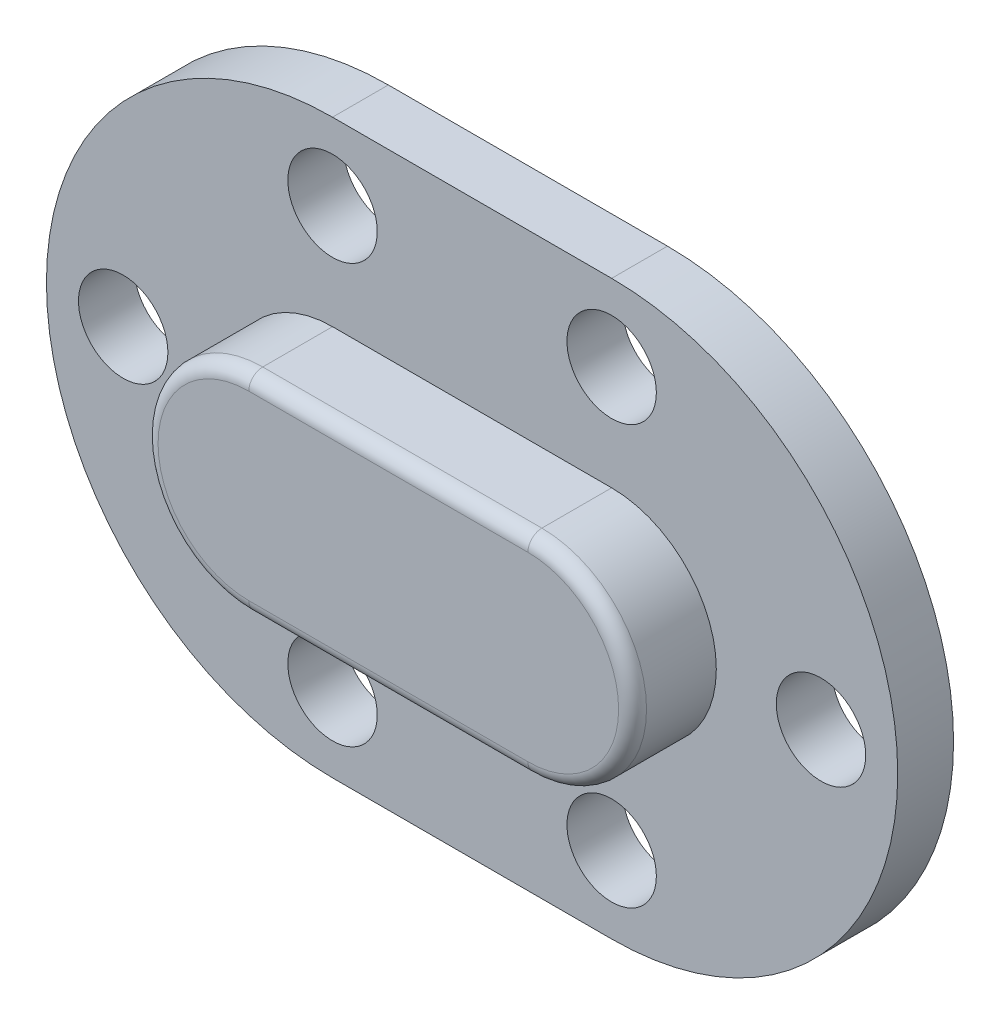
ISO-10303-21;
HEADER;
FILE_DESCRIPTION(('STEP AP214'),'2;1');
FILE_NAME('part.step','',(''),(''),'','','');
FILE_SCHEMA(('AUTOMOTIVE_DESIGN { 1 0 10303 214 1 1 1 1 }'));
ENDSEC;
DATA;
#1=APPLICATION_CONTEXT('core data for automotive mechanical design processes');
#2=APPLICATION_PROTOCOL_DEFINITION('international standard','automotive_design',2000,#1);
#3=PRODUCT_CONTEXT('',#1,'mechanical');
#4=PRODUCT('Part','Part','',(#3));
#5=PRODUCT_RELATED_PRODUCT_CATEGORY('part','',(#4));
#6=PRODUCT_DEFINITION_FORMATION('','',#4);
#7=PRODUCT_DEFINITION_CONTEXT('part definition',#1,'design');
#8=PRODUCT_DEFINITION('design','',#6,#7);
#9=PRODUCT_DEFINITION_SHAPE('','',#8);
#10=(LENGTH_UNIT() NAMED_UNIT(*) SI_UNIT(.MILLI.,.METRE.));
#11=(NAMED_UNIT(*) PLANE_ANGLE_UNIT() SI_UNIT($,.RADIAN.));
#12=(NAMED_UNIT(*) SI_UNIT($,.STERADIAN.) SOLID_ANGLE_UNIT());
#13=UNCERTAINTY_MEASURE_WITH_UNIT(LENGTH_MEASURE(1.E-05),#10,'distance_accuracy_value','');
#14=(GEOMETRIC_REPRESENTATION_CONTEXT(3) GLOBAL_UNCERTAINTY_ASSIGNED_CONTEXT((#13)) GLOBAL_UNIT_ASSIGNED_CONTEXT((#10,
#11,#12)) REPRESENTATION_CONTEXT('',''));
#15=CARTESIAN_POINT('',(0.,0.,0.));
#16=DIRECTION('',(0.,0.,1.));
#17=DIRECTION('',(1.,0.,0.));
#18=AXIS2_PLACEMENT_3D('',#15,#16,#17);
#19=CARTESIAN_POINT('',(-10.,0.,4.));
#20=DIRECTION('',(0.,0.,-1.));
#21=DIRECTION('',(-1.,0.,0.));
#22=AXIS2_PLACEMENT_3D('',#19,#20,#21);
#23=CYLINDRICAL_SURFACE('',#22,20.5);
#24=CARTESIAN_POINT('',(-10.,0.,0.));
#25=DIRECTION('',(0.,0.,1.));
#26=DIRECTION('',(1.,0.,0.));
#27=AXIS2_PLACEMENT_3D('',#24,#25,#26);
#28=CIRCLE('',#27,20.5);
#29=CARTESIAN_POINT('',(-10.,20.5,0.));
#30=VERTEX_POINT('',#29);
#31=CARTESIAN_POINT('',(-10.,-20.5,0.));
#32=VERTEX_POINT('',#31);
#33=EDGE_CURVE('E175',#30,#32,#28,.T.);
#34=ORIENTED_EDGE('',*,*,#33,.T.);
#35=DIRECTION('',(0.,0.,-1.));
#36=VECTOR('',#35,1.);
#37=CARTESIAN_POINT('',(-10.,-20.5,4.));
#38=LINE('',#37,#36);
#39=CARTESIAN_POINT('',(-10.,-20.5,4.));
#40=VERTEX_POINT('',#39);
#41=EDGE_CURVE('E213',#40,#32,#38,.T.);
#42=ORIENTED_EDGE('',*,*,#41,.F.);
#43=CARTESIAN_POINT('',(-10.,0.,4.));
#44=DIRECTION('',(0.,0.,1.));
#45=DIRECTION('',(1.,0.,0.));
#46=AXIS2_PLACEMENT_3D('',#43,#44,#45);
#47=CIRCLE('',#46,20.5);
#48=CARTESIAN_POINT('',(-10.,20.5,4.));
#49=VERTEX_POINT('',#48);
#50=EDGE_CURVE('E176',#49,#40,#47,.T.);
#51=ORIENTED_EDGE('',*,*,#50,.F.);
#52=DIRECTION('',(0.,0.,-1.));
#53=VECTOR('',#52,1.);
#54=CARTESIAN_POINT('',(-10.,20.5,4.));
#55=LINE('',#54,#53);
#56=EDGE_CURVE('E190',#49,#30,#55,.T.);
#57=ORIENTED_EDGE('',*,*,#56,.T.);
#58=EDGE_LOOP('',(#34,#42,#51,#57));
#59=FACE_BOUND('',#58,.T.);
#60=ADVANCED_FACE('F38',(#59),#23,.T.);
#61=CARTESIAN_POINT('',(-10.,-20.5,4.));
#62=DIRECTION('',(0.,1.,0.));
#63=DIRECTION('',(0.,0.,1.));
#64=AXIS2_PLACEMENT_3D('',#61,#62,#63);
#65=PLANE('',#64);
#66=DIRECTION('',(1.,0.,0.));
#67=VECTOR('',#66,1.);
#68=CARTESIAN_POINT('',(-10.,-20.5,0.));
#69=LINE('',#68,#67);
#70=CARTESIAN_POINT('',(10.,-20.5,0.));
#71=VERTEX_POINT('',#70);
#72=EDGE_CURVE('E194',#32,#71,#69,.T.);
#73=ORIENTED_EDGE('',*,*,#72,.T.);
#74=DIRECTION('',(0.,0.,-1.));
#75=VECTOR('',#74,1.);
#76=CARTESIAN_POINT('',(10.,-20.5,4.));
#77=LINE('',#76,#75);
#78=CARTESIAN_POINT('',(10.,-20.5,4.));
#79=VERTEX_POINT('',#78);
#80=EDGE_CURVE('E209',#79,#71,#77,.T.);
#81=ORIENTED_EDGE('',*,*,#80,.F.);
#82=DIRECTION('',(1.,0.,0.));
#83=VECTOR('',#82,1.);
#84=CARTESIAN_POINT('',(-10.,-20.5,4.));
#85=LINE('',#84,#83);
#86=EDGE_CURVE('E180',#40,#79,#85,.T.);
#87=ORIENTED_EDGE('',*,*,#86,.F.);
#88=ORIENTED_EDGE('',*,*,#41,.T.);
#89=EDGE_LOOP('',(#73,#81,#87,#88));
#90=FACE_BOUND('',#89,.T.);
#91=ADVANCED_FACE('F287',(#90),#65,.F.);
#92=CARTESIAN_POINT('',(10.,0.,4.));
#93=DIRECTION('',(0.,0.,-1.));
#94=DIRECTION('',(-1.,0.,0.));
#95=AXIS2_PLACEMENT_3D('',#92,#93,#94);
#96=CYLINDRICAL_SURFACE('',#95,20.5);
#97=CARTESIAN_POINT('',(10.,0.,0.));
#98=DIRECTION('',(0.,0.,1.));
#99=DIRECTION('',(1.,0.,0.));
#100=AXIS2_PLACEMENT_3D('',#97,#98,#99);
#101=CIRCLE('',#100,20.5);
#102=CARTESIAN_POINT('',(10.,20.5,0.));
#103=VERTEX_POINT('',#102);
#104=EDGE_CURVE('E197',#71,#103,#101,.T.);
#105=ORIENTED_EDGE('',*,*,#104,.T.);
#106=DIRECTION('',(0.,0.,-1.));
#107=VECTOR('',#106,1.);
#108=CARTESIAN_POINT('',(10.,20.5,4.));
#109=LINE('',#108,#107);
#110=CARTESIAN_POINT('',(10.,20.5,4.));
#111=VERTEX_POINT('',#110);
#112=EDGE_CURVE('E205',#111,#103,#109,.T.);
#113=ORIENTED_EDGE('',*,*,#112,.F.);
#114=CARTESIAN_POINT('',(10.,0.,4.));
#115=DIRECTION('',(0.,0.,1.));
#116=DIRECTION('',(1.,0.,0.));
#117=AXIS2_PLACEMENT_3D('',#114,#115,#116);
#118=CIRCLE('',#117,20.5);
#119=EDGE_CURVE('E184',#79,#111,#118,.T.);
#120=ORIENTED_EDGE('',*,*,#119,.F.);
#121=ORIENTED_EDGE('',*,*,#80,.T.);
#122=EDGE_LOOP('',(#105,#113,#120,#121));
#123=FACE_BOUND('',#122,.T.);
#124=ADVANCED_FACE('F293',(#123),#96,.T.);
#125=CARTESIAN_POINT('',(-10.,20.5,4.));
#126=DIRECTION('',(0.,-1.,0.));
#127=DIRECTION('',(0.,0.,-1.));
#128=AXIS2_PLACEMENT_3D('',#125,#126,#127);
#129=PLANE('',#128);
#130=DIRECTION('',(-1.,0.,0.));
#131=VECTOR('',#130,1.);
#132=CARTESIAN_POINT('',(-10.,20.5,0.));
#133=LINE('',#132,#131);
#134=EDGE_CURVE('E181',#103,#30,#133,.T.);
#135=ORIENTED_EDGE('',*,*,#134,.T.);
#136=ORIENTED_EDGE('',*,*,#56,.F.);
#137=DIRECTION('',(-1.,0.,0.));
#138=VECTOR('',#137,1.);
#139=CARTESIAN_POINT('',(-10.,20.5,4.));
#140=LINE('',#139,#138);
#141=EDGE_CURVE('E187',#111,#49,#140,.T.);
#142=ORIENTED_EDGE('',*,*,#141,.F.);
#143=ORIENTED_EDGE('',*,*,#112,.T.);
#144=EDGE_LOOP('',(#135,#136,#142,#143));
#145=FACE_BOUND('',#144,.T.);
#146=ADVANCED_FACE('F338',(#145),#129,.F.);
#147=CARTESIAN_POINT('',(-10.,0.,4.));
#148=DIRECTION('',(0.,0.,1.));
#149=DIRECTION('',(1.,0.,0.));
#150=AXIS2_PLACEMENT_3D('',#147,#148,#149);
#151=PLANE('',#150);
#152=CARTESIAN_POINT('',(10.,15.,4.));
#153=DIRECTION('',(0.,0.,1.));
#154=DIRECTION('',(1.,0.,0.));
#155=AXIS2_PLACEMENT_3D('',#152,#153,#154);
#156=CIRCLE('',#155,3.20354728429973);
#157=CARTESIAN_POINT('',(13.2035472842997,15.,4.));
#158=VERTEX_POINT('',#157);
#159=EDGE_CURVE('E485',#158,#158,#156,.F.);
#160=ORIENTED_EDGE('',*,*,#159,.T.);
#161=EDGE_LOOP('',(#160));
#162=FACE_BOUND('',#161,.T.);
#163=CARTESIAN_POINT('',(25.,0.,4.));
#164=DIRECTION('',(0.,0.,1.));
#165=DIRECTION('',(1.,0.,0.));
#166=AXIS2_PLACEMENT_3D('',#163,#164,#165);
#167=CIRCLE('',#166,3.20354728429973);
#168=CARTESIAN_POINT('',(28.2035472842997,0.,4.));
#169=VERTEX_POINT('',#168);
#170=EDGE_CURVE('E496',#169,#169,#167,.F.);
#171=ORIENTED_EDGE('',*,*,#170,.T.);
#172=EDGE_LOOP('',(#171));
#173=FACE_BOUND('',#172,.T.);
#174=CARTESIAN_POINT('',(10.,-15.,4.));
#175=DIRECTION('',(0.,0.,1.));
#176=DIRECTION('',(1.,0.,0.));
#177=AXIS2_PLACEMENT_3D('',#174,#175,#176);
#178=CIRCLE('',#177,3.20354728429973);
#179=CARTESIAN_POINT('',(13.2035472842997,-15.,4.));
#180=VERTEX_POINT('',#179);
#181=EDGE_CURVE('E490',#180,#180,#178,.F.);
#182=ORIENTED_EDGE('',*,*,#181,.T.);
#183=EDGE_LOOP('',(#182));
#184=FACE_BOUND('',#183,.T.);
#185=CARTESIAN_POINT('',(-25.,0.,4.));
#186=DIRECTION('',(0.,0.,1.));
#187=DIRECTION('',(1.,0.,0.));
#188=AXIS2_PLACEMENT_3D('',#185,#186,#187);
#189=CIRCLE('',#188,3.20354728429973);
#190=CARTESIAN_POINT('',(-21.7964527157003,0.,4.));
#191=VERTEX_POINT('',#190);
#192=EDGE_CURVE('E522',#191,#191,#189,.T.);
#193=ORIENTED_EDGE('',*,*,#192,.F.);
#194=EDGE_LOOP('',(#193));
#195=FACE_BOUND('',#194,.T.);
#196=CARTESIAN_POINT('',(-10.,-15.,4.));
#197=DIRECTION('',(0.,0.,1.));
#198=DIRECTION('',(1.,0.,0.));
#199=AXIS2_PLACEMENT_3D('',#196,#197,#198);
#200=CIRCLE('',#199,3.20354728429973);
#201=CARTESIAN_POINT('',(-6.79645271570027,-15.,4.));
#202=VERTEX_POINT('',#201);
#203=EDGE_CURVE('E515',#202,#202,#200,.T.);
#204=ORIENTED_EDGE('',*,*,#203,.F.);
#205=EDGE_LOOP('',(#204));
#206=FACE_BOUND('',#205,.T.);
#207=CARTESIAN_POINT('',(-10.,15.,4.));
#208=DIRECTION('',(0.,0.,1.));
#209=DIRECTION('',(1.,0.,0.));
#210=AXIS2_PLACEMENT_3D('',#207,#208,#209);
#211=CIRCLE('',#210,3.20354728429973);
#212=CARTESIAN_POINT('',(-6.79645271570027,15.,4.));
#213=VERTEX_POINT('',#212);
#214=EDGE_CURVE('E242',#213,#213,#211,.T.);
#215=ORIENTED_EDGE('',*,*,#214,.F.);
#216=EDGE_LOOP('',(#215));
#217=FACE_BOUND('',#216,.T.);
#218=CARTESIAN_POINT('',(-10.,0.,4.));
#219=DIRECTION('',(0.,0.,1.));
#220=DIRECTION('',(1.,0.,0.));
#221=AXIS2_PLACEMENT_3D('',#218,#219,#220);
#222=CIRCLE('',#221,7.5);
#223=CARTESIAN_POINT('',(-10.,7.5,4.));
#224=VERTEX_POINT('',#223);
#225=CARTESIAN_POINT('',(-10.,-7.5,4.));
#226=VERTEX_POINT('',#225);
#227=EDGE_CURVE('E147',#224,#226,#222,.T.);
#228=ORIENTED_EDGE('',*,*,#227,.F.);
#229=DIRECTION('',(-1.,0.,0.));
#230=VECTOR('',#229,1.);
#231=CARTESIAN_POINT('',(-10.,7.5,4.));
#232=LINE('',#231,#230);
#233=CARTESIAN_POINT('',(10.,7.5,4.));
#234=VERTEX_POINT('',#233);
#235=EDGE_CURVE('E159',#234,#224,#232,.T.);
#236=ORIENTED_EDGE('',*,*,#235,.F.);
#237=CARTESIAN_POINT('',(10.,0.,4.));
#238=DIRECTION('',(0.,0.,1.));
#239=DIRECTION('',(1.,0.,0.));
#240=AXIS2_PLACEMENT_3D('',#237,#238,#239);
#241=CIRCLE('',#240,7.5);
#242=CARTESIAN_POINT('',(10.,-7.5,4.));
#243=VERTEX_POINT('',#242);
#244=EDGE_CURVE('E155',#243,#234,#241,.T.);
#245=ORIENTED_EDGE('',*,*,#244,.F.);
#246=DIRECTION('',(1.,0.,0.));
#247=VECTOR('',#246,1.);
#248=CARTESIAN_POINT('',(-10.,-7.5,4.));
#249=LINE('',#248,#247);
#250=EDGE_CURVE('E151',#226,#243,#249,.T.);
#251=ORIENTED_EDGE('',*,*,#250,.F.);
#252=EDGE_LOOP('',(#228,#236,#245,#251));
#253=FACE_BOUND('',#252,.T.);
#254=ORIENTED_EDGE('',*,*,#50,.T.);
#255=ORIENTED_EDGE('',*,*,#86,.T.);
#256=ORIENTED_EDGE('',*,*,#119,.T.);
#257=ORIENTED_EDGE('',*,*,#141,.T.);
#258=EDGE_LOOP('',(#254,#255,#256,#257));
#259=FACE_BOUND('',#258,.T.);
#260=ADVANCED_FACE('F327',(#162,#173,#184,#195,#206,#217,#253,#259),#151,.T.);
#261=CARTESIAN_POINT('',(-10.,0.,0.));
#262=DIRECTION('',(0.,0.,1.));
#263=DIRECTION('',(1.,0.,0.));
#264=AXIS2_PLACEMENT_3D('',#261,#262,#263);
#265=PLANE('',#264);
#266=CARTESIAN_POINT('',(10.,15.,0.));
#267=DIRECTION('',(0.,0.,-1.));
#268=DIRECTION('',(-1.,0.,0.));
#269=AXIS2_PLACEMENT_3D('',#266,#267,#268);
#270=CIRCLE('',#269,3.20354728429973);
#271=CARTESIAN_POINT('',(6.79645271570027,15.,0.));
#272=VERTEX_POINT('',#271);
#273=EDGE_CURVE('E488',#272,#272,#270,.T.);
#274=ORIENTED_EDGE('',*,*,#273,.F.);
#275=EDGE_LOOP('',(#274));
#276=FACE_BOUND('',#275,.T.);
#277=CARTESIAN_POINT('',(25.,0.,0.));
#278=DIRECTION('',(0.,0.,-1.));
#279=DIRECTION('',(0.,1.,0.));
#280=AXIS2_PLACEMENT_3D('',#277,#278,#279);
#281=CIRCLE('',#280,3.20354728429973);
#282=CARTESIAN_POINT('',(25.,3.20354728429968,0.));
#283=VERTEX_POINT('',#282);
#284=EDGE_CURVE('E491',#283,#283,#281,.T.);
#285=ORIENTED_EDGE('',*,*,#284,.F.);
#286=EDGE_LOOP('',(#285));
#287=FACE_BOUND('',#286,.T.);
#288=CARTESIAN_POINT('',(10.,-15.,0.));
#289=DIRECTION('',(0.,0.,-1.));
#290=DIRECTION('',(1.,0.,0.));
#291=AXIS2_PLACEMENT_3D('',#288,#289,#290);
#292=CIRCLE('',#291,3.20354728429973);
#293=CARTESIAN_POINT('',(13.2035472842997,-15.,0.));
#294=VERTEX_POINT('',#293);
#295=EDGE_CURVE('E499',#294,#294,#292,.T.);
#296=ORIENTED_EDGE('',*,*,#295,.F.);
#297=EDGE_LOOP('',(#296));
#298=FACE_BOUND('',#297,.T.);
#299=CARTESIAN_POINT('',(-25.,0.,0.));
#300=DIRECTION('',(0.,0.,1.));
#301=DIRECTION('',(0.,1.,0.));
#302=AXIS2_PLACEMENT_3D('',#299,#300,#301);
#303=CIRCLE('',#302,3.20354728429973);
#304=CARTESIAN_POINT('',(-25.,3.20354728429968,0.));
#305=VERTEX_POINT('',#304);
#306=EDGE_CURVE('E511',#305,#305,#303,.T.);
#307=ORIENTED_EDGE('',*,*,#306,.T.);
#308=EDGE_LOOP('',(#307));
#309=FACE_BOUND('',#308,.T.);
#310=CARTESIAN_POINT('',(-10.,-15.,0.));
#311=DIRECTION('',(0.,0.,1.));
#312=DIRECTION('',(-1.,0.,0.));
#313=AXIS2_PLACEMENT_3D('',#310,#311,#312);
#314=CIRCLE('',#313,3.20354728429973);
#315=CARTESIAN_POINT('',(-13.2035472842997,-15.,0.));
#316=VERTEX_POINT('',#315);
#317=EDGE_CURVE('E510',#316,#316,#314,.T.);
#318=ORIENTED_EDGE('',*,*,#317,.T.);
#319=EDGE_LOOP('',(#318));
#320=FACE_BOUND('',#319,.T.);
#321=CARTESIAN_POINT('',(-10.,15.,0.));
#322=DIRECTION('',(0.,0.,1.));
#323=DIRECTION('',(1.,0.,0.));
#324=AXIS2_PLACEMENT_3D('',#321,#322,#323);
#325=CIRCLE('',#324,3.20354728429973);
#326=CARTESIAN_POINT('',(-6.79645271570027,15.,0.));
#327=VERTEX_POINT('',#326);
#328=EDGE_CURVE('E526',#327,#327,#325,.T.);
#329=ORIENTED_EDGE('',*,*,#328,.T.);
#330=EDGE_LOOP('',(#329));
#331=FACE_BOUND('',#330,.T.);
#332=CARTESIAN_POINT('',(10.,0.,0.));
#333=DIRECTION('',(0.,0.,-1.));
#334=DIRECTION('',(-1.,0.,0.));
#335=AXIS2_PLACEMENT_3D('',#332,#333,#334);
#336=CIRCLE('',#335,3.99999999999999);
#337=CARTESIAN_POINT('',(6.00000000000001,0.,0.));
#338=VERTEX_POINT('',#337);
#339=EDGE_CURVE('E133',#338,#338,#336,.T.);
#340=ORIENTED_EDGE('',*,*,#339,.F.);
#341=EDGE_LOOP('',(#340));
#342=FACE_BOUND('',#341,.T.);
#343=CARTESIAN_POINT('',(-10.,0.,0.));
#344=DIRECTION('',(0.,0.,-1.));
#345=DIRECTION('',(-1.,0.,0.));
#346=AXIS2_PLACEMENT_3D('',#343,#344,#345);
#347=CIRCLE('',#346,3.99999999999999);
#348=CARTESIAN_POINT('',(-14.,0.,0.));
#349=VERTEX_POINT('',#348);
#350=EDGE_CURVE('E132',#349,#349,#347,.T.);
#351=ORIENTED_EDGE('',*,*,#350,.F.);
#352=EDGE_LOOP('',(#351));
#353=FACE_BOUND('',#352,.T.);
#354=ORIENTED_EDGE('',*,*,#33,.F.);
#355=ORIENTED_EDGE('',*,*,#134,.F.);
#356=ORIENTED_EDGE('',*,*,#104,.F.);
#357=ORIENTED_EDGE('',*,*,#72,.F.);
#358=EDGE_LOOP('',(#354,#355,#356,#357));
#359=FACE_BOUND('',#358,.T.);
#360=ADVANCED_FACE('F324',(#276,#287,#298,#309,#320,#331,#342,#353,#359),#265,.F.);
#361=CARTESIAN_POINT('',(-10.,0.,10.));
#362=DIRECTION('',(0.,0.,-1.));
#363=DIRECTION('',(-1.,0.,0.));
#364=AXIS2_PLACEMENT_3D('',#361,#362,#363);
#365=CYLINDRICAL_SURFACE('',#364,7.5);
#366=DIRECTION('',(0.,0.,-1.));
#367=VECTOR('',#366,1.);
#368=CARTESIAN_POINT('',(-10.,-7.5,10.));
#369=LINE('',#368,#367);
#370=CARTESIAN_POINT('',(-10.,-7.5,9.));
#371=VERTEX_POINT('',#370);
#372=EDGE_CURVE('E172',#371,#226,#369,.T.);
#373=ORIENTED_EDGE('',*,*,#372,.F.);
#374=CARTESIAN_POINT('',(-10.,0.,9.));
#375=DIRECTION('',(0.,0.,1.));
#376=DIRECTION('',(1.,0.,0.));
#377=AXIS2_PLACEMENT_3D('',#374,#375,#376);
#378=CIRCLE('',#377,7.5);
#379=CARTESIAN_POINT('',(-10.,7.5,9.));
#380=VERTEX_POINT('',#379);
#381=EDGE_CURVE('E11',#371,#380,#378,.F.);
#382=ORIENTED_EDGE('',*,*,#381,.T.);
#383=DIRECTION('',(0.,0.,-1.));
#384=VECTOR('',#383,1.);
#385=CARTESIAN_POINT('',(-10.,7.5,10.));
#386=LINE('',#385,#384);
#387=EDGE_CURVE('E163',#380,#224,#386,.T.);
#388=ORIENTED_EDGE('',*,*,#387,.T.);
#389=ORIENTED_EDGE('',*,*,#227,.T.);
#390=EDGE_LOOP('',(#373,#382,#388,#389));
#391=FACE_BOUND('',#390,.T.);
#392=ADVANCED_FACE('F264',(#391),#365,.T.);
#393=CARTESIAN_POINT('',(-10.,-7.5,10.));
#394=DIRECTION('',(0.,1.,0.));
#395=DIRECTION('',(0.,0.,1.));
#396=AXIS2_PLACEMENT_3D('',#393,#394,#395);
#397=PLANE('',#396);
#398=DIRECTION('',(0.,0.,-1.));
#399=VECTOR('',#398,1.);
#400=CARTESIAN_POINT('',(10.,-7.5,10.));
#401=LINE('',#400,#399);
#402=CARTESIAN_POINT('',(10.,-7.5,9.));
#403=VERTEX_POINT('',#402);
#404=EDGE_CURVE('E169',#403,#243,#401,.T.);
#405=ORIENTED_EDGE('',*,*,#404,.F.);
#406=DIRECTION('',(1.,0.,0.));
#407=VECTOR('',#406,1.);
#408=CARTESIAN_POINT('',(-10.,-7.5,9.));
#409=LINE('',#408,#407);
#410=EDGE_CURVE('E48',#403,#371,#409,.F.);
#411=ORIENTED_EDGE('',*,*,#410,.T.);
#412=ORIENTED_EDGE('',*,*,#372,.T.);
#413=ORIENTED_EDGE('',*,*,#250,.T.);
#414=EDGE_LOOP('',(#405,#411,#412,#413));
#415=FACE_BOUND('',#414,.T.);
#416=ADVANCED_FACE('F384',(#415),#397,.F.);
#417=CARTESIAN_POINT('',(10.,0.,10.));
#418=DIRECTION('',(0.,0.,-1.));
#419=DIRECTION('',(-1.,0.,0.));
#420=AXIS2_PLACEMENT_3D('',#417,#418,#419);
#421=CYLINDRICAL_SURFACE('',#420,7.5);
#422=DIRECTION('',(0.,0.,-1.));
#423=VECTOR('',#422,1.);
#424=CARTESIAN_POINT('',(10.,7.5,10.));
#425=LINE('',#424,#423);
#426=CARTESIAN_POINT('',(10.,7.5,9.));
#427=VERTEX_POINT('',#426);
#428=EDGE_CURVE('E166',#427,#234,#425,.T.);
#429=ORIENTED_EDGE('',*,*,#428,.F.);
#430=CARTESIAN_POINT('',(10.,0.,9.));
#431=DIRECTION('',(0.,0.,1.));
#432=DIRECTION('',(1.,0.,0.));
#433=AXIS2_PLACEMENT_3D('',#430,#431,#432);
#434=CIRCLE('',#433,7.5);
#435=EDGE_CURVE('E63',#427,#403,#434,.F.);
#436=ORIENTED_EDGE('',*,*,#435,.T.);
#437=ORIENTED_EDGE('',*,*,#404,.T.);
#438=ORIENTED_EDGE('',*,*,#244,.T.);
#439=EDGE_LOOP('',(#429,#436,#437,#438));
#440=FACE_BOUND('',#439,.T.);
#441=ADVANCED_FACE('F284',(#440),#421,.T.);
#442=CARTESIAN_POINT('',(-10.,7.5,10.));
#443=DIRECTION('',(0.,-1.,0.));
#444=DIRECTION('',(0.,0.,-1.));
#445=AXIS2_PLACEMENT_3D('',#442,#443,#444);
#446=PLANE('',#445);
#447=ORIENTED_EDGE('',*,*,#387,.F.);
#448=DIRECTION('',(-1.,0.,0.));
#449=VECTOR('',#448,1.);
#450=CARTESIAN_POINT('',(10.,7.5,9.));
#451=LINE('',#450,#449);
#452=EDGE_CURVE('E230',#380,#427,#451,.F.);
#453=ORIENTED_EDGE('',*,*,#452,.T.);
#454=ORIENTED_EDGE('',*,*,#428,.T.);
#455=ORIENTED_EDGE('',*,*,#235,.T.);
#456=EDGE_LOOP('',(#447,#453,#454,#455));
#457=FACE_BOUND('',#456,.T.);
#458=ADVANCED_FACE('F268',(#457),#446,.F.);
#459=CARTESIAN_POINT('',(-10.,0.,10.));
#460=DIRECTION('',(0.,0.,1.));
#461=DIRECTION('',(1.,0.,0.));
#462=AXIS2_PLACEMENT_3D('',#459,#460,#461);
#463=PLANE('',#462);
#464=CARTESIAN_POINT('',(10.,0.,10.));
#465=DIRECTION('',(0.,0.,1.));
#466=DIRECTION('',(1.,0.,0.));
#467=AXIS2_PLACEMENT_3D('',#464,#465,#466);
#468=CIRCLE('',#467,6.5);
#469=CARTESIAN_POINT('',(10.,-6.5,10.));
#470=VERTEX_POINT('',#469);
#471=CARTESIAN_POINT('',(10.,6.5,10.));
#472=VERTEX_POINT('',#471);
#473=EDGE_CURVE('E223',#470,#472,#468,.T.);
#474=ORIENTED_EDGE('',*,*,#473,.T.);
#475=DIRECTION('',(-1.,0.,0.));
#476=VECTOR('',#475,1.);
#477=CARTESIAN_POINT('',(-10.,6.5,10.));
#478=LINE('',#477,#476);
#479=CARTESIAN_POINT('',(-10.,6.5,10.));
#480=VERTEX_POINT('',#479);
#481=EDGE_CURVE('E226',#472,#480,#478,.T.);
#482=ORIENTED_EDGE('',*,*,#481,.T.);
#483=CARTESIAN_POINT('',(-10.,0.,10.));
#484=DIRECTION('',(0.,0.,1.));
#485=DIRECTION('',(1.,0.,0.));
#486=AXIS2_PLACEMENT_3D('',#483,#484,#485);
#487=CIRCLE('',#486,6.5);
#488=CARTESIAN_POINT('',(-10.,-6.5,10.));
#489=VERTEX_POINT('',#488);
#490=EDGE_CURVE('E217',#480,#489,#487,.T.);
#491=ORIENTED_EDGE('',*,*,#490,.T.);
#492=DIRECTION('',(1.,0.,0.));
#493=VECTOR('',#492,1.);
#494=CARTESIAN_POINT('',(10.,-6.5,10.));
#495=LINE('',#494,#493);
#496=EDGE_CURVE('E220',#489,#470,#495,.T.);
#497=ORIENTED_EDGE('',*,*,#496,.T.);
#498=EDGE_LOOP('',(#474,#482,#491,#497));
#499=FACE_BOUND('',#498,.T.);
#500=ADVANCED_FACE('F274',(#499),#463,.T.);
#501=CARTESIAN_POINT('',(-10.,0.,7.));
#502=DIRECTION('',(0.,0.,-1.));
#503=DIRECTION('',(-1.,0.,0.));
#504=AXIS2_PLACEMENT_3D('',#501,#502,#503);
#505=CONICAL_SURFACE('',#504,4.,1.02974425867665);
#506=CARTESIAN_POINT('',(-10.,0.,9.40344247611024));
#507=VERTEX_POINT('',#506);
#508=VERTEX_LOOP('',#507);
#509=FACE_BOUND('',#508,.T.);
#510=CARTESIAN_POINT('',(-10.,0.,7.));
#511=DIRECTION('',(0.,0.,-1.));
#512=DIRECTION('',(-1.,0.,0.));
#513=AXIS2_PLACEMENT_3D('',#510,#511,#512);
#514=CIRCLE('',#513,4.);
#515=CARTESIAN_POINT('',(-14.,0.,7.));
#516=VERTEX_POINT('',#515);
#517=EDGE_CURVE('E138',#516,#516,#514,.T.);
#518=ORIENTED_EDGE('',*,*,#517,.T.);
#519=EDGE_LOOP('',(#518));
#520=FACE_BOUND('',#519,.T.);
#521=ADVANCED_FACE('F276',(#509,#520),#505,.F.);
#522=CARTESIAN_POINT('',(-10.,0.,0.));
#523=DIRECTION('',(0.,0.,-1.));
#524=DIRECTION('',(-1.,0.,0.));
#525=AXIS2_PLACEMENT_3D('',#522,#523,#524);
#526=CYLINDRICAL_SURFACE('',#525,3.99999999999999);
#527=ORIENTED_EDGE('',*,*,#517,.F.);
#528=EDGE_LOOP('',(#527));
#529=FACE_BOUND('',#528,.T.);
#530=ORIENTED_EDGE('',*,*,#350,.T.);
#531=EDGE_LOOP('',(#530));
#532=FACE_BOUND('',#531,.T.);
#533=ADVANCED_FACE('F125',(#529,#532),#526,.F.);
#534=CARTESIAN_POINT('',(10.,0.,7.));
#535=DIRECTION('',(0.,0.,-1.));
#536=DIRECTION('',(-1.,0.,0.));
#537=AXIS2_PLACEMENT_3D('',#534,#535,#536);
#538=CONICAL_SURFACE('',#537,4.,1.02974425867665);
#539=CARTESIAN_POINT('',(10.,0.,9.40344247611024));
#540=VERTEX_POINT('',#539);
#541=VERTEX_LOOP('',#540);
#542=FACE_BOUND('',#541,.T.);
#543=CARTESIAN_POINT('',(10.,0.,7.));
#544=DIRECTION('',(0.,0.,-1.));
#545=DIRECTION('',(-1.,0.,0.));
#546=AXIS2_PLACEMENT_3D('',#543,#544,#545);
#547=CIRCLE('',#546,4.);
#548=CARTESIAN_POINT('',(6.,0.,7.));
#549=VERTEX_POINT('',#548);
#550=EDGE_CURVE('E129',#549,#549,#547,.T.);
#551=ORIENTED_EDGE('',*,*,#550,.T.);
#552=EDGE_LOOP('',(#551));
#553=FACE_BOUND('',#552,.T.);
#554=ADVANCED_FACE('F121',(#542,#553),#538,.F.);
#555=CARTESIAN_POINT('',(10.,0.,0.));
#556=DIRECTION('',(0.,0.,-1.));
#557=DIRECTION('',(-1.,0.,0.));
#558=AXIS2_PLACEMENT_3D('',#555,#556,#557);
#559=CYLINDRICAL_SURFACE('',#558,3.99999999999999);
#560=ORIENTED_EDGE('',*,*,#550,.F.);
#561=EDGE_LOOP('',(#560));
#562=FACE_BOUND('',#561,.T.);
#563=ORIENTED_EDGE('',*,*,#339,.T.);
#564=EDGE_LOOP('',(#563));
#565=FACE_BOUND('',#564,.T.);
#566=ADVANCED_FACE('F124',(#562,#565),#559,.F.);
#567=CARTESIAN_POINT('',(-10.,-6.5,9.));
#568=DIRECTION('',(-1.,0.,0.));
#569=DIRECTION('',(0.,0.,1.));
#570=AXIS2_PLACEMENT_3D('',#567,#568,#569);
#571=CYLINDRICAL_SURFACE('',#570,1.);
#572=CARTESIAN_POINT('',(-10.,-6.5,9.));
#573=DIRECTION('',(-1.,0.,0.));
#574=DIRECTION('',(0.,0.,1.));
#575=AXIS2_PLACEMENT_3D('',#572,#573,#574);
#576=CIRCLE('',#575,1.);
#577=EDGE_CURVE('E244',#371,#489,#576,.T.);
#578=ORIENTED_EDGE('',*,*,#577,.F.);
#579=ORIENTED_EDGE('',*,*,#410,.F.);
#580=CARTESIAN_POINT('',(10.,-6.5,9.));
#581=DIRECTION('',(1.,0.,0.));
#582=DIRECTION('',(0.,0.,-1.));
#583=AXIS2_PLACEMENT_3D('',#580,#581,#582);
#584=CIRCLE('',#583,1.);
#585=EDGE_CURVE('E42',#470,#403,#584,.T.);
#586=ORIENTED_EDGE('',*,*,#585,.F.);
#587=ORIENTED_EDGE('',*,*,#496,.F.);
#588=EDGE_LOOP('',(#578,#579,#586,#587));
#589=FACE_BOUND('',#588,.T.);
#590=ADVANCED_FACE('F40',(#589),#571,.T.);
#591=CARTESIAN_POINT('',(10.,0.,9.));
#592=DIRECTION('',(0.,0.,1.));
#593=DIRECTION('',(1.,0.,0.));
#594=AXIS2_PLACEMENT_3D('',#591,#592,#593);
#595=TOROIDAL_SURFACE('',#594,6.5,1.);
#596=ORIENTED_EDGE('',*,*,#585,.T.);
#597=ORIENTED_EDGE('',*,*,#435,.F.);
#598=CARTESIAN_POINT('',(10.,6.5,9.));
#599=DIRECTION('',(-1.,0.,0.));
#600=DIRECTION('',(0.,0.,1.));
#601=AXIS2_PLACEMENT_3D('',#598,#599,#600);
#602=CIRCLE('',#601,1.);
#603=EDGE_CURVE('E241',#472,#427,#602,.T.);
#604=ORIENTED_EDGE('',*,*,#603,.F.);
#605=ORIENTED_EDGE('',*,*,#473,.F.);
#606=EDGE_LOOP('',(#596,#597,#604,#605));
#607=FACE_BOUND('',#606,.T.);
#608=ADVANCED_FACE('F256',(#607),#595,.T.);
#609=CARTESIAN_POINT('',(-10.,0.,9.));
#610=DIRECTION('',(0.,0.,1.));
#611=DIRECTION('',(1.,0.,0.));
#612=AXIS2_PLACEMENT_3D('',#609,#610,#611);
#613=TOROIDAL_SURFACE('',#612,6.5,1.);
#614=ORIENTED_EDGE('',*,*,#577,.T.);
#615=ORIENTED_EDGE('',*,*,#490,.F.);
#616=CARTESIAN_POINT('',(-10.,6.5,9.));
#617=DIRECTION('',(1.,0.,0.));
#618=DIRECTION('',(0.,0.,-1.));
#619=AXIS2_PLACEMENT_3D('',#616,#617,#618);
#620=CIRCLE('',#619,1.);
#621=EDGE_CURVE('E238',#380,#480,#620,.T.);
#622=ORIENTED_EDGE('',*,*,#621,.F.);
#623=ORIENTED_EDGE('',*,*,#381,.F.);
#624=EDGE_LOOP('',(#614,#615,#622,#623));
#625=FACE_BOUND('',#624,.T.);
#626=ADVANCED_FACE('F261',(#625),#613,.T.);
#627=CARTESIAN_POINT('',(-10.,6.5,9.));
#628=DIRECTION('',(1.,0.,0.));
#629=DIRECTION('',(0.,0.,-1.));
#630=AXIS2_PLACEMENT_3D('',#627,#628,#629);
#631=CYLINDRICAL_SURFACE('',#630,1.);
#632=ORIENTED_EDGE('',*,*,#603,.T.);
#633=ORIENTED_EDGE('',*,*,#452,.F.);
#634=ORIENTED_EDGE('',*,*,#621,.T.);
#635=ORIENTED_EDGE('',*,*,#481,.F.);
#636=EDGE_LOOP('',(#632,#633,#634,#635));
#637=FACE_BOUND('',#636,.T.);
#638=ADVANCED_FACE('F271',(#637),#631,.T.);
#639=CARTESIAN_POINT('',(-10.,15.,0.));
#640=DIRECTION('',(0.,0.,1.));
#641=DIRECTION('',(1.,0.,0.));
#642=AXIS2_PLACEMENT_3D('',#639,#640,#641);
#643=CYLINDRICAL_SURFACE('',#642,3.20354728429973);
#644=ORIENTED_EDGE('',*,*,#214,.T.);
#645=EDGE_LOOP('',(#644));
#646=FACE_BOUND('',#645,.T.);
#647=ORIENTED_EDGE('',*,*,#328,.F.);
#648=EDGE_LOOP('',(#647));
#649=FACE_BOUND('',#648,.T.);
#650=ADVANCED_FACE('F300',(#646,#649),#643,.F.);
#651=CARTESIAN_POINT('',(-10.,-15.,0.));
#652=DIRECTION('',(0.,0.,1.));
#653=DIRECTION('',(1.,0.,0.));
#654=AXIS2_PLACEMENT_3D('',#651,#652,#653);
#655=CYLINDRICAL_SURFACE('',#654,3.20354728429973);
#656=ORIENTED_EDGE('',*,*,#203,.T.);
#657=EDGE_LOOP('',(#656));
#658=FACE_BOUND('',#657,.T.);
#659=ORIENTED_EDGE('',*,*,#317,.F.);
#660=EDGE_LOOP('',(#659));
#661=FACE_BOUND('',#660,.T.);
#662=ADVANCED_FACE('F433',(#658,#661),#655,.F.);
#663=CARTESIAN_POINT('',(-25.,0.,0.));
#664=DIRECTION('',(0.,0.,1.));
#665=DIRECTION('',(1.,0.,0.));
#666=AXIS2_PLACEMENT_3D('',#663,#664,#665);
#667=CYLINDRICAL_SURFACE('',#666,3.20354728429973);
#668=ORIENTED_EDGE('',*,*,#192,.T.);
#669=EDGE_LOOP('',(#668));
#670=FACE_BOUND('',#669,.T.);
#671=ORIENTED_EDGE('',*,*,#306,.F.);
#672=EDGE_LOOP('',(#671));
#673=FACE_BOUND('',#672,.T.);
#674=ADVANCED_FACE('F441',(#670,#673),#667,.F.);
#675=CARTESIAN_POINT('',(10.,-15.,0.));
#676=DIRECTION('',(0.,0.,1.));
#677=DIRECTION('',(1.,0.,0.));
#678=AXIS2_PLACEMENT_3D('',#675,#676,#677);
#679=CYLINDRICAL_SURFACE('',#678,3.20354728429973);
#680=ORIENTED_EDGE('',*,*,#181,.F.);
#681=EDGE_LOOP('',(#680));
#682=FACE_BOUND('',#681,.T.);
#683=ORIENTED_EDGE('',*,*,#295,.T.);
#684=EDGE_LOOP('',(#683));
#685=FACE_BOUND('',#684,.T.);
#686=ADVANCED_FACE('F449',(#682,#685),#679,.F.);
#687=CARTESIAN_POINT('',(25.,0.,0.));
#688=DIRECTION('',(0.,0.,1.));
#689=DIRECTION('',(1.,0.,0.));
#690=AXIS2_PLACEMENT_3D('',#687,#688,#689);
#691=CYLINDRICAL_SURFACE('',#690,3.20354728429973);
#692=ORIENTED_EDGE('',*,*,#170,.F.);
#693=EDGE_LOOP('',(#692));
#694=FACE_BOUND('',#693,.T.);
#695=ORIENTED_EDGE('',*,*,#284,.T.);
#696=EDGE_LOOP('',(#695));
#697=FACE_BOUND('',#696,.T.);
#698=ADVANCED_FACE('F459',(#694,#697),#691,.F.);
#699=CARTESIAN_POINT('',(10.,15.,0.));
#700=DIRECTION('',(0.,0.,1.));
#701=DIRECTION('',(1.,0.,0.));
#702=AXIS2_PLACEMENT_3D('',#699,#700,#701);
#703=CYLINDRICAL_SURFACE('',#702,3.20354728429973);
#704=ORIENTED_EDGE('',*,*,#159,.F.);
#705=EDGE_LOOP('',(#704));
#706=FACE_BOUND('',#705,.T.);
#707=ORIENTED_EDGE('',*,*,#273,.T.);
#708=EDGE_LOOP('',(#707));
#709=FACE_BOUND('',#708,.T.);
#710=ADVANCED_FACE('F466',(#706,#709),#703,.F.);
#711=CLOSED_SHELL('',(#60,#91,#124,#146,#260,#360,#392,#416,#441,#458,#500,#521,#533,#554,#566,
#590,#608,#626,#638,#650,#662,#674,#686,#698,#710));
#712=MANIFOLD_SOLID_BREP('B2',#711);
#713=ADVANCED_BREP_SHAPE_REPRESENTATION('',(#18,#712),#14);
#714=SHAPE_DEFINITION_REPRESENTATION(#9,#713);
ENDSEC;
END-ISO-10303-21;
